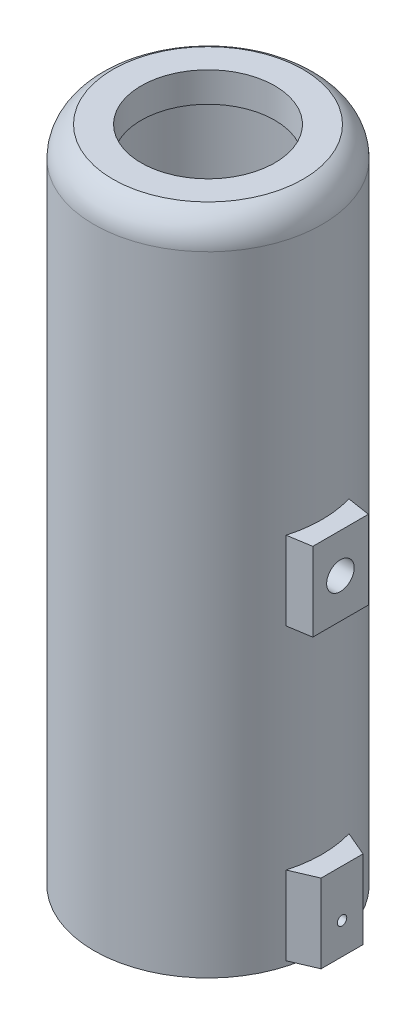
ISO-10303-21;
HEADER;
FILE_DESCRIPTION(('STEP AP214'),'2;1');
FILE_NAME('part.step','',(''),(''),'','','');
FILE_SCHEMA(('AUTOMOTIVE_DESIGN { 1 0 10303 214 1 1 1 1 }'));
ENDSEC;
DATA;
#1=APPLICATION_CONTEXT('core data for automotive mechanical design processes');
#2=APPLICATION_PROTOCOL_DEFINITION('international standard','automotive_design',2000,#1);
#3=PRODUCT_CONTEXT('',#1,'mechanical');
#4=PRODUCT('Part','Part','',(#3));
#5=PRODUCT_RELATED_PRODUCT_CATEGORY('part','',(#4));
#6=PRODUCT_DEFINITION_FORMATION('','',#4);
#7=PRODUCT_DEFINITION_CONTEXT('part definition',#1,'design');
#8=PRODUCT_DEFINITION('design','',#6,#7);
#9=PRODUCT_DEFINITION_SHAPE('','',#8);
#10=(LENGTH_UNIT() NAMED_UNIT(*) SI_UNIT(.MILLI.,.METRE.));
#11=(NAMED_UNIT(*) PLANE_ANGLE_UNIT() SI_UNIT($,.RADIAN.));
#12=(NAMED_UNIT(*) SI_UNIT($,.STERADIAN.) SOLID_ANGLE_UNIT());
#13=UNCERTAINTY_MEASURE_WITH_UNIT(LENGTH_MEASURE(1.E-05),#10,'distance_accuracy_value','');
#14=(GEOMETRIC_REPRESENTATION_CONTEXT(3) GLOBAL_UNCERTAINTY_ASSIGNED_CONTEXT((#13)) GLOBAL_UNIT_ASSIGNED_CONTEXT((#10,
#11,#12)) REPRESENTATION_CONTEXT('',''));
#15=CARTESIAN_POINT('',(0.,0.,0.));
#16=DIRECTION('',(0.,0.,1.));
#17=DIRECTION('',(1.,0.,0.));
#18=AXIS2_PLACEMENT_3D('',#15,#16,#17);
#19=CARTESIAN_POINT('',(0.,0.,0.));
#20=DIRECTION('',(0.,-1.,0.));
#21=DIRECTION('',(0.,0.,-1.));
#22=AXIS2_PLACEMENT_3D('',#19,#20,#21);
#23=CYLINDRICAL_SURFACE('',#22,14.5);
#24=CARTESIAN_POINT('',(0.,10.617688180379,0.));
#25=DIRECTION('',(0.,-1.,0.));
#26=DIRECTION('',(0.,0.,-1.));
#27=AXIS2_PLACEMENT_3D('',#24,#25,#26);
#28=CIRCLE('',#27,14.5);
#29=CARTESIAN_POINT('',(13.9382685998278,10.617688180379,-3.996832300592));
#30=VERTEX_POINT('',#29);
#31=CARTESIAN_POINT('',(13.9364503504449,10.617688180379,4.00316769940799));
#32=VERTEX_POINT('',#31);
#33=EDGE_CURVE('E217',#30,#32,#28,.T.);
#34=ORIENTED_EDGE('',*,*,#33,.F.);
#35=DIRECTION('',(0.,-1.,0.));
#36=VECTOR('',#35,1.);
#37=CARTESIAN_POINT('',(13.9382685998278,0.,-3.996832300592));
#38=LINE('',#37,#36);
#39=CARTESIAN_POINT('',(13.9382685998278,0.617688180378981,-3.996832300592));
#40=VERTEX_POINT('',#39);
#41=EDGE_CURVE('E231',#30,#40,#38,.T.);
#42=ORIENTED_EDGE('',*,*,#41,.T.);
#43=CARTESIAN_POINT('',(0.,0.617688180378981,0.));
#44=DIRECTION('',(0.,1.,0.));
#45=DIRECTION('',(0.,0.,1.));
#46=AXIS2_PLACEMENT_3D('',#43,#44,#45);
#47=CIRCLE('',#46,14.5);
#48=CARTESIAN_POINT('',(13.9364503504449,0.617688180379016,4.00316769940799));
#49=VERTEX_POINT('',#48);
#50=EDGE_CURVE('E235',#49,#40,#47,.T.);
#51=ORIENTED_EDGE('',*,*,#50,.F.);
#52=DIRECTION('',(0.,-1.,0.));
#53=VECTOR('',#52,1.);
#54=CARTESIAN_POINT('',(13.9364503504449,0.,4.00316769940799));
#55=LINE('',#54,#53);
#56=EDGE_CURVE('E144',#32,#49,#55,.T.);
#57=ORIENTED_EDGE('',*,*,#56,.F.);
#58=EDGE_LOOP('',(#34,#42,#51,#57));
#59=FACE_BOUND('',#58,.T.);
#60=CARTESIAN_POINT('',(0.,47.5,0.));
#61=DIRECTION('',(0.,-1.,0.));
#62=DIRECTION('',(0.,0.,-1.));
#63=AXIS2_PLACEMENT_3D('',#60,#61,#62);
#64=CIRCLE('',#63,14.5);
#65=CARTESIAN_POINT('',(13.9373598647664,47.5,-3.99999999999998));
#66=VERTEX_POINT('',#65);
#67=CARTESIAN_POINT('',(13.9373598647664,47.5,3.99999999999998));
#68=VERTEX_POINT('',#67);
#69=EDGE_CURVE('E234',#66,#68,#64,.T.);
#70=ORIENTED_EDGE('',*,*,#69,.F.);
#71=DIRECTION('',(0.,-1.,0.));
#72=VECTOR('',#71,1.);
#73=CARTESIAN_POINT('',(13.9373598647664,0.,-3.99999999999999));
#74=LINE('',#73,#72);
#75=CARTESIAN_POINT('',(13.9373598647664,37.5,-3.99999999999999));
#76=VERTEX_POINT('',#75);
#77=EDGE_CURVE('E240',#66,#76,#74,.T.);
#78=ORIENTED_EDGE('',*,*,#77,.T.);
#79=CARTESIAN_POINT('',(0.,37.5,0.));
#80=DIRECTION('',(0.,1.,0.));
#81=DIRECTION('',(0.,0.,1.));
#82=AXIS2_PLACEMENT_3D('',#79,#80,#81);
#83=CIRCLE('',#82,14.5);
#84=CARTESIAN_POINT('',(13.9373598647664,37.5,3.99999999999998));
#85=VERTEX_POINT('',#84);
#86=EDGE_CURVE('E244',#85,#76,#83,.T.);
#87=ORIENTED_EDGE('',*,*,#86,.F.);
#88=DIRECTION('',(0.,-1.,0.));
#89=VECTOR('',#88,1.);
#90=CARTESIAN_POINT('',(13.9373598647664,0.,3.99999999999998));
#91=LINE('',#90,#89);
#92=EDGE_CURVE('E247',#68,#85,#91,.T.);
#93=ORIENTED_EDGE('',*,*,#92,.F.);
#94=EDGE_LOOP('',(#70,#78,#87,#93));
#95=FACE_BOUND('',#94,.T.);
#96=CARTESIAN_POINT('',(0.,80.,0.));
#97=DIRECTION('',(0.,-1.,0.));
#98=DIRECTION('',(0.,0.,-1.));
#99=AXIS2_PLACEMENT_3D('',#96,#97,#98);
#100=CIRCLE('',#99,14.5);
#101=CARTESIAN_POINT('',(0.,80.,-14.5));
#102=VERTEX_POINT('',#101);
#103=EDGE_CURVE('E262',#102,#102,#100,.T.);
#104=ORIENTED_EDGE('',*,*,#103,.T.);
#105=EDGE_LOOP('',(#104));
#106=FACE_BOUND('',#105,.T.);
#107=CARTESIAN_POINT('',(0.,0.,0.));
#108=DIRECTION('',(0.,-1.,0.));
#109=DIRECTION('',(0.,0.,-1.));
#110=AXIS2_PLACEMENT_3D('',#107,#108,#109);
#111=CIRCLE('',#110,14.5);
#112=CARTESIAN_POINT('',(0.,0.,-14.5));
#113=VERTEX_POINT('',#112);
#114=EDGE_CURVE('E55',#113,#113,#111,.T.);
#115=ORIENTED_EDGE('',*,*,#114,.F.);
#116=EDGE_LOOP('',(#115));
#117=FACE_BOUND('',#116,.T.);
#118=CARTESIAN_POINT('',(0.,37.5,0.));
#119=DIRECTION('',(0.,-1.,0.));
#120=DIRECTION('',(0.,0.,1.));
#121=AXIS2_PLACEMENT_3D('',#118,#119,#120);
#122=CIRCLE('',#121,14.5);
#123=CARTESIAN_POINT('',(-13.9373598647664,37.5,3.99999999999998));
#124=VERTEX_POINT('',#123);
#125=CARTESIAN_POINT('',(-13.9373598647664,37.5,-3.99999999999999));
#126=VERTEX_POINT('',#125);
#127=EDGE_CURVE('E62',#124,#126,#122,.T.);
#128=ORIENTED_EDGE('',*,*,#127,.T.);
#129=DIRECTION('',(0.,-1.,0.));
#130=VECTOR('',#129,1.);
#131=CARTESIAN_POINT('',(-13.9373598647664,0.,-3.99999999999999));
#132=LINE('',#131,#130);
#133=CARTESIAN_POINT('',(-13.9373598647664,47.5,-3.99999999999998));
#134=VERTEX_POINT('',#133);
#135=EDGE_CURVE('E200',#134,#126,#132,.T.);
#136=ORIENTED_EDGE('',*,*,#135,.F.);
#137=CARTESIAN_POINT('',(0.,47.5,0.));
#138=DIRECTION('',(0.,1.,0.));
#139=DIRECTION('',(0.,0.,-1.));
#140=AXIS2_PLACEMENT_3D('',#137,#138,#139);
#141=CIRCLE('',#140,14.5);
#142=CARTESIAN_POINT('',(-13.9373598647664,47.5,3.99999999999998));
#143=VERTEX_POINT('',#142);
#144=EDGE_CURVE('E206',#134,#143,#141,.T.);
#145=ORIENTED_EDGE('',*,*,#144,.T.);
#146=DIRECTION('',(0.,-1.,0.));
#147=VECTOR('',#146,1.);
#148=CARTESIAN_POINT('',(-13.9373598647664,0.,3.99999999999998));
#149=LINE('',#148,#147);
#150=EDGE_CURVE('E178',#143,#124,#149,.T.);
#151=ORIENTED_EDGE('',*,*,#150,.T.);
#152=EDGE_LOOP('',(#128,#136,#145,#151));
#153=FACE_BOUND('',#152,.T.);
#154=ADVANCED_FACE('F47',(#59,#95,#106,#117,#153),#23,.T.);
#155=CARTESIAN_POINT('',(0.,0.,0.));
#156=DIRECTION('',(0.,-1.,0.));
#157=DIRECTION('',(0.,0.,-1.));
#158=AXIS2_PLACEMENT_3D('',#155,#156,#157);
#159=CYLINDRICAL_SURFACE('',#158,12.);
#160=CARTESIAN_POINT('',(0.,0.,0.));
#161=DIRECTION('',(0.,-1.,0.));
#162=DIRECTION('',(0.,0.,-1.));
#163=AXIS2_PLACEMENT_3D('',#160,#161,#162);
#164=CIRCLE('',#163,12.);
#165=CARTESIAN_POINT('',(0.,0.,-12.));
#166=VERTEX_POINT('',#165);
#167=EDGE_CURVE('E13',#166,#166,#164,.T.);
#168=ORIENTED_EDGE('',*,*,#167,.T.);
#169=EDGE_LOOP('',(#168));
#170=FACE_BOUND('',#169,.T.);
#171=CARTESIAN_POINT('',(0.,80.,0.));
#172=DIRECTION('',(0.,-1.,0.));
#173=DIRECTION('',(0.,0.,-1.));
#174=AXIS2_PLACEMENT_3D('',#171,#172,#173);
#175=CIRCLE('',#174,12.);
#176=CARTESIAN_POINT('',(0.,80.,-12.));
#177=VERTEX_POINT('',#176);
#178=EDGE_CURVE('E243',#177,#177,#175,.T.);
#179=ORIENTED_EDGE('',*,*,#178,.F.);
#180=EDGE_LOOP('',(#179));
#181=FACE_BOUND('',#180,.T.);
#182=ADVANCED_FACE('F49',(#170,#181),#159,.F.);
#183=CARTESIAN_POINT('',(12.,0.,0.));
#184=DIRECTION('',(0.,-1.,0.));
#185=DIRECTION('',(0.,0.,-1.));
#186=AXIS2_PLACEMENT_3D('',#183,#184,#185);
#187=PLANE('',#186);
#188=ORIENTED_EDGE('',*,*,#114,.T.);
#189=EDGE_LOOP('',(#188));
#190=FACE_BOUND('',#189,.T.);
#191=ORIENTED_EDGE('',*,*,#167,.F.);
#192=EDGE_LOOP('',(#191));
#193=FACE_BOUND('',#192,.T.);
#194=ADVANCED_FACE('F267',(#190,#193),#187,.T.);
#195=CARTESIAN_POINT('',(0.,80.,0.));
#196=DIRECTION('',(0.,-1.,0.));
#197=DIRECTION('',(0.,0.,-1.));
#198=AXIS2_PLACEMENT_3D('',#195,#196,#197);
#199=TOROIDAL_SURFACE('',#198,10.3002002332007,4.19979976679926);
#200=CARTESIAN_POINT('',(0.,83.7944165825053,0.));
#201=DIRECTION('',(0.,-1.,0.));
#202=DIRECTION('',(0.,0.,-1.));
#203=AXIS2_PLACEMENT_3D('',#200,#201,#202);
#204=CIRCLE('',#203,12.1004004664015);
#205=CARTESIAN_POINT('',(0.,83.7944165825053,-12.1004004664015));
#206=VERTEX_POINT('',#205);
#207=EDGE_CURVE('E259',#206,#206,#204,.T.);
#208=ORIENTED_EDGE('',*,*,#207,.T.);
#209=EDGE_LOOP('',(#208));
#210=FACE_BOUND('',#209,.T.);
#211=ORIENTED_EDGE('',*,*,#103,.F.);
#212=EDGE_LOOP('',(#211));
#213=FACE_BOUND('',#212,.T.);
#214=ADVANCED_FACE('F344',(#210,#213),#199,.T.);
#215=CARTESIAN_POINT('',(8.5,83.7944165825053,0.));
#216=DIRECTION('',(0.,1.,0.));
#217=DIRECTION('',(0.,0.,1.));
#218=AXIS2_PLACEMENT_3D('',#215,#216,#217);
#219=PLANE('',#218);
#220=CARTESIAN_POINT('',(0.,83.7944165825053,0.));
#221=DIRECTION('',(0.,-1.,0.));
#222=DIRECTION('',(0.,0.,-1.));
#223=AXIS2_PLACEMENT_3D('',#220,#221,#222);
#224=CIRCLE('',#223,8.5);
#225=CARTESIAN_POINT('',(0.,83.7944165825053,-8.5));
#226=VERTEX_POINT('',#225);
#227=EDGE_CURVE('E256',#226,#226,#224,.T.);
#228=ORIENTED_EDGE('',*,*,#227,.T.);
#229=EDGE_LOOP('',(#228));
#230=FACE_BOUND('',#229,.T.);
#231=ORIENTED_EDGE('',*,*,#207,.F.);
#232=EDGE_LOOP('',(#231));
#233=FACE_BOUND('',#232,.T.);
#234=ADVANCED_FACE('F340',(#230,#233),#219,.T.);
#235=CARTESIAN_POINT('',(0.,0.,0.));
#236=DIRECTION('',(0.,-1.,0.));
#237=DIRECTION('',(0.,0.,-1.));
#238=AXIS2_PLACEMENT_3D('',#235,#236,#237);
#239=CYLINDRICAL_SURFACE('',#238,8.5);
#240=CARTESIAN_POINT('',(0.,80.,0.));
#241=DIRECTION('',(0.,-1.,0.));
#242=DIRECTION('',(0.,0.,-1.));
#243=AXIS2_PLACEMENT_3D('',#240,#241,#242);
#244=CIRCLE('',#243,8.5);
#245=CARTESIAN_POINT('',(0.,80.,-8.5));
#246=VERTEX_POINT('',#245);
#247=EDGE_CURVE('E253',#246,#246,#244,.T.);
#248=ORIENTED_EDGE('',*,*,#247,.T.);
#249=EDGE_LOOP('',(#248));
#250=FACE_BOUND('',#249,.T.);
#251=ORIENTED_EDGE('',*,*,#227,.F.);
#252=EDGE_LOOP('',(#251));
#253=FACE_BOUND('',#252,.T.);
#254=ADVANCED_FACE('F336',(#250,#253),#239,.F.);
#255=CARTESIAN_POINT('',(12.,80.,0.));
#256=DIRECTION('',(0.,-1.,0.));
#257=DIRECTION('',(0.,0.,-1.));
#258=AXIS2_PLACEMENT_3D('',#255,#256,#257);
#259=PLANE('',#258);
#260=ORIENTED_EDGE('',*,*,#178,.T.);
#261=EDGE_LOOP('',(#260));
#262=FACE_BOUND('',#261,.T.);
#263=ORIENTED_EDGE('',*,*,#247,.F.);
#264=EDGE_LOOP('',(#263));
#265=FACE_BOUND('',#264,.T.);
#266=ADVANCED_FACE('F329',(#262,#265),#259,.T.);
#267=CARTESIAN_POINT('',(13.9373598647664,47.5,3.99999999999998));
#268=DIRECTION('',(0.,1.,0.));
#269=DIRECTION('',(0.,0.,1.));
#270=AXIS2_PLACEMENT_3D('',#267,#268,#269);
#271=PLANE('',#270);
#272=DIRECTION('',(-0.987420935954633,0.,-0.158113551723046));
#273=VECTOR('',#272,1.);
#274=CARTESIAN_POINT('',(16.8633842019587,47.5,-3.53146213176624));
#275=LINE('',#274,#273);
#276=CARTESIAN_POINT('',(16.8633842019587,47.5,-3.53146213176624));
#277=VERTEX_POINT('',#276);
#278=EDGE_CURVE('E214',#277,#66,#275,.T.);
#279=ORIENTED_EDGE('',*,*,#278,.T.);
#280=ORIENTED_EDGE('',*,*,#69,.T.);
#281=DIRECTION('',(0.987420935954634,0.,-0.158113551723044));
#282=VECTOR('',#281,1.);
#283=CARTESIAN_POINT('',(13.9373598647664,47.5,3.99999999999998));
#284=LINE('',#283,#282);
#285=CARTESIAN_POINT('',(16.8633842019587,47.5,3.53146213176624));
#286=VERTEX_POINT('',#285);
#287=EDGE_CURVE('E213',#68,#286,#284,.T.);
#288=ORIENTED_EDGE('',*,*,#287,.T.);
#289=DIRECTION('',(0.,0.,-1.));
#290=VECTOR('',#289,1.);
#291=CARTESIAN_POINT('',(16.8633842019587,47.5,3.53146213176624));
#292=LINE('',#291,#290);
#293=EDGE_CURVE('E210',#286,#277,#292,.T.);
#294=ORIENTED_EDGE('',*,*,#293,.T.);
#295=EDGE_LOOP('',(#279,#280,#288,#294));
#296=FACE_BOUND('',#295,.T.);
#297=ADVANCED_FACE('F326',(#296),#271,.T.);
#298=CARTESIAN_POINT('',(13.9373598647664,37.5,-3.99999999999999));
#299=DIRECTION('',(0.,-1.,0.));
#300=DIRECTION('',(0.,0.,-1.));
#301=AXIS2_PLACEMENT_3D('',#298,#299,#300);
#302=PLANE('',#301);
#303=DIRECTION('',(-0.987420935954633,0.,-0.158113551723046));
#304=VECTOR('',#303,1.);
#305=CARTESIAN_POINT('',(16.8633842019587,37.5,-3.53146213176624));
#306=LINE('',#305,#304);
#307=CARTESIAN_POINT('',(16.8633842019587,37.5,-3.53146213176624));
#308=VERTEX_POINT('',#307);
#309=EDGE_CURVE('E221',#308,#76,#306,.T.);
#310=ORIENTED_EDGE('',*,*,#309,.F.);
#311=DIRECTION('',(0.,0.,-1.));
#312=VECTOR('',#311,1.);
#313=CARTESIAN_POINT('',(16.8633842019587,37.5,3.53146213176624));
#314=LINE('',#313,#312);
#315=CARTESIAN_POINT('',(16.8633842019587,37.5,3.53146213176625));
#316=VERTEX_POINT('',#315);
#317=EDGE_CURVE('E219',#316,#308,#314,.T.);
#318=ORIENTED_EDGE('',*,*,#317,.F.);
#319=DIRECTION('',(0.987420935954634,0.,-0.158113551723044));
#320=VECTOR('',#319,1.);
#321=CARTESIAN_POINT('',(13.9373598647664,37.5,3.99999999999998));
#322=LINE('',#321,#320);
#323=EDGE_CURVE('E209',#85,#316,#322,.T.);
#324=ORIENTED_EDGE('',*,*,#323,.F.);
#325=ORIENTED_EDGE('',*,*,#86,.T.);
#326=EDGE_LOOP('',(#310,#318,#324,#325));
#327=FACE_BOUND('',#326,.T.);
#328=ADVANCED_FACE('F322',(#327),#302,.T.);
#329=CARTESIAN_POINT('',(13.9364503504449,10.617688180379,4.00316769940799));
#330=DIRECTION('',(0.,1.,0.));
#331=DIRECTION('',(0.,0.,1.));
#332=AXIS2_PLACEMENT_3D('',#329,#330,#331);
#333=PLANE('',#332);
#334=DIRECTION('',(-0.919710823156126,0.,-0.39259648720981));
#335=VECTOR('',#334,1.);
#336=CARTESIAN_POINT('',(17.0525339543547,10.617688180379,-2.66744744652363));
#337=LINE('',#336,#335);
#338=CARTESIAN_POINT('',(17.0525339543547,10.617688180379,-2.66744744652363));
#339=VERTEX_POINT('',#338);
#340=EDGE_CURVE('E164',#339,#30,#337,.T.);
#341=ORIENTED_EDGE('',*,*,#340,.T.);
#342=ORIENTED_EDGE('',*,*,#33,.T.);
#343=DIRECTION('',(0.919117704025341,0.,-0.393983053121813));
#344=VECTOR('',#343,1.);
#345=CARTESIAN_POINT('',(13.9364503504449,10.617688180379,4.00316769940799));
#346=LINE('',#345,#344);
#347=CARTESIAN_POINT('',(17.0525339543547,10.617688180379,2.66744744652364));
#348=VERTEX_POINT('',#347);
#349=EDGE_CURVE('E174',#32,#348,#346,.T.);
#350=ORIENTED_EDGE('',*,*,#349,.T.);
#351=DIRECTION('',(0.,0.,-1.));
#352=VECTOR('',#351,1.);
#353=CARTESIAN_POINT('',(17.0525339543547,10.617688180379,2.66744744652364));
#354=LINE('',#353,#352);
#355=EDGE_CURVE('E155',#348,#339,#354,.T.);
#356=ORIENTED_EDGE('',*,*,#355,.T.);
#357=EDGE_LOOP('',(#341,#342,#350,#356));
#358=FACE_BOUND('',#357,.T.);
#359=ADVANCED_FACE('F313',(#358),#333,.T.);
#360=CARTESIAN_POINT('',(13.9382685998278,0.617688180378981,-3.996832300592));
#361=DIRECTION('',(0.,-1.,0.));
#362=DIRECTION('',(0.,0.,-1.));
#363=AXIS2_PLACEMENT_3D('',#360,#361,#362);
#364=PLANE('',#363);
#365=DIRECTION('',(-0.919710823156126,0.,-0.39259648720981));
#366=VECTOR('',#365,1.);
#367=CARTESIAN_POINT('',(17.0525339543547,0.617688180378995,-2.66744744652363));
#368=LINE('',#367,#366);
#369=CARTESIAN_POINT('',(17.0525339543547,0.617688180378999,-2.66744744652363));
#370=VERTEX_POINT('',#369);
#371=EDGE_CURVE('E70',#370,#40,#368,.T.);
#372=ORIENTED_EDGE('',*,*,#371,.F.);
#373=DIRECTION('',(0.,0.,-1.));
#374=VECTOR('',#373,1.);
#375=CARTESIAN_POINT('',(17.0525339543547,0.617688180378995,2.66744744652364));
#376=LINE('',#375,#374);
#377=CARTESIAN_POINT('',(17.0525339543547,0.617688180378999,2.66744744652365));
#378=VERTEX_POINT('',#377);
#379=EDGE_CURVE('E148',#378,#370,#376,.T.);
#380=ORIENTED_EDGE('',*,*,#379,.F.);
#381=DIRECTION('',(0.919117704025341,0.,-0.393983053121813));
#382=VECTOR('',#381,1.);
#383=CARTESIAN_POINT('',(13.9364503504449,0.617688180378995,4.00316769940799));
#384=LINE('',#383,#382);
#385=EDGE_CURVE('E138',#49,#378,#384,.T.);
#386=ORIENTED_EDGE('',*,*,#385,.F.);
#387=ORIENTED_EDGE('',*,*,#50,.T.);
#388=EDGE_LOOP('',(#372,#380,#386,#387));
#389=FACE_BOUND('',#388,.T.);
#390=ADVANCED_FACE('F158',(#389),#364,.T.);
#391=CARTESIAN_POINT('',(16.8633842019587,224.625691680575,-3.53146213176624));
#392=DIRECTION('',(-0.158113551723046,0.,0.987420935954633));
#393=DIRECTION('',(0.987420935954633,0.,0.158113551723046));
#394=AXIS2_PLACEMENT_3D('',#391,#392,#393);
#395=PLANE('',#394);
#396=DIRECTION('',(0.,-1.,0.));
#397=VECTOR('',#396,1.);
#398=CARTESIAN_POINT('',(16.8633842019587,224.625691680575,-3.53146213176624));
#399=LINE('',#398,#397);
#400=EDGE_CURVE('E226',#277,#308,#399,.T.);
#401=ORIENTED_EDGE('',*,*,#400,.T.);
#402=ORIENTED_EDGE('',*,*,#309,.T.);
#403=ORIENTED_EDGE('',*,*,#77,.F.);
#404=ORIENTED_EDGE('',*,*,#278,.F.);
#405=EDGE_LOOP('',(#401,#402,#403,#404));
#406=FACE_BOUND('',#405,.T.);
#407=ADVANCED_FACE('F308',(#406),#395,.F.);
#408=CARTESIAN_POINT('',(16.8633842019587,224.625691680575,3.53146213176624));
#409=DIRECTION('',(-1.,0.,0.));
#410=DIRECTION('',(0.,0.,1.));
#411=AXIS2_PLACEMENT_3D('',#408,#409,#410);
#412=PLANE('',#411);
#413=CARTESIAN_POINT('',(16.8633842019587,42.5128676573704,0.0212645796614426));
#414=DIRECTION('',(1.,0.,0.));
#415=DIRECTION('',(0.,0.,-1.));
#416=AXIS2_PLACEMENT_3D('',#413,#414,#415);
#417=CIRCLE('',#416,1.74999999999976);
#418=CARTESIAN_POINT('',(16.8633842019587,42.5128676573704,-1.72873542033832));
#419=VERTEX_POINT('',#418);
#420=EDGE_CURVE('E171',#419,#419,#417,.T.);
#421=ORIENTED_EDGE('',*,*,#420,.F.);
#422=EDGE_LOOP('',(#421));
#423=FACE_BOUND('',#422,.T.);
#424=DIRECTION('',(0.,-1.,0.));
#425=VECTOR('',#424,1.);
#426=CARTESIAN_POINT('',(16.8633842019587,224.625691680575,3.53146213176624));
#427=LINE('',#426,#425);
#428=EDGE_CURVE('E223',#286,#316,#427,.T.);
#429=ORIENTED_EDGE('',*,*,#428,.T.);
#430=ORIENTED_EDGE('',*,*,#317,.T.);
#431=ORIENTED_EDGE('',*,*,#400,.F.);
#432=ORIENTED_EDGE('',*,*,#293,.F.);
#433=EDGE_LOOP('',(#429,#430,#431,#432));
#434=FACE_BOUND('',#433,.T.);
#435=ADVANCED_FACE('F311',(#423,#434),#412,.F.);
#436=CARTESIAN_POINT('',(13.9373598647664,224.625691680575,3.99999999999998));
#437=DIRECTION('',(-0.158113551723044,0.,-0.987420935954634));
#438=DIRECTION('',(-0.987420935954634,0.,0.158113551723044));
#439=AXIS2_PLACEMENT_3D('',#436,#437,#438);
#440=PLANE('',#439);
#441=ORIENTED_EDGE('',*,*,#92,.T.);
#442=ORIENTED_EDGE('',*,*,#323,.T.);
#443=ORIENTED_EDGE('',*,*,#428,.F.);
#444=ORIENTED_EDGE('',*,*,#287,.F.);
#445=EDGE_LOOP('',(#441,#442,#443,#444));
#446=FACE_BOUND('',#445,.T.);
#447=ADVANCED_FACE('F307',(#446),#440,.F.);
#448=CARTESIAN_POINT('',(-13.9373598647664,47.5,3.99999999999998));
#449=DIRECTION('',(0.,1.,0.));
#450=DIRECTION('',(0.,0.,1.));
#451=AXIS2_PLACEMENT_3D('',#448,#449,#450);
#452=PLANE('',#451);
#453=DIRECTION('',(0.987420935954633,0.,-0.158113551723046));
#454=VECTOR('',#453,1.);
#455=CARTESIAN_POINT('',(-16.8633842019587,47.5,-3.53146213176624));
#456=LINE('',#455,#454);
#457=CARTESIAN_POINT('',(-16.8633842019587,47.5,-3.53146213176624));
#458=VERTEX_POINT('',#457);
#459=EDGE_CURVE('E203',#458,#134,#456,.T.);
#460=ORIENTED_EDGE('',*,*,#459,.F.);
#461=DIRECTION('',(0.,0.,-1.));
#462=VECTOR('',#461,1.);
#463=CARTESIAN_POINT('',(-16.8633842019587,47.5,3.53146213176624));
#464=LINE('',#463,#462);
#465=CARTESIAN_POINT('',(-16.8633842019587,47.5,3.53146213176624));
#466=VERTEX_POINT('',#465);
#467=EDGE_CURVE('E195',#466,#458,#464,.T.);
#468=ORIENTED_EDGE('',*,*,#467,.F.);
#469=DIRECTION('',(-0.987420935954634,0.,-0.158113551723044));
#470=VECTOR('',#469,1.);
#471=CARTESIAN_POINT('',(-13.9373598647664,47.5,3.99999999999998));
#472=LINE('',#471,#470);
#473=EDGE_CURVE('E187',#143,#466,#472,.T.);
#474=ORIENTED_EDGE('',*,*,#473,.F.);
#475=ORIENTED_EDGE('',*,*,#144,.F.);
#476=EDGE_LOOP('',(#460,#468,#474,#475));
#477=FACE_BOUND('',#476,.T.);
#478=ADVANCED_FACE('F288',(#477),#452,.T.);
#479=CARTESIAN_POINT('',(-13.9373598647664,37.5,-3.99999999999999));
#480=DIRECTION('',(0.,-1.,0.));
#481=DIRECTION('',(0.,0.,-1.));
#482=AXIS2_PLACEMENT_3D('',#479,#480,#481);
#483=PLANE('',#482);
#484=DIRECTION('',(0.987420935954633,0.,-0.158113551723046));
#485=VECTOR('',#484,1.);
#486=CARTESIAN_POINT('',(-16.8633842019587,37.5,-3.53146213176624));
#487=LINE('',#486,#485);
#488=CARTESIAN_POINT('',(-16.8633842019587,37.5,-3.53146213176624));
#489=VERTEX_POINT('',#488);
#490=EDGE_CURVE('E198',#489,#126,#487,.T.);
#491=ORIENTED_EDGE('',*,*,#490,.T.);
#492=ORIENTED_EDGE('',*,*,#127,.F.);
#493=DIRECTION('',(-0.987420935954634,0.,-0.158113551723044));
#494=VECTOR('',#493,1.);
#495=CARTESIAN_POINT('',(-13.9373598647664,37.5,3.99999999999998));
#496=LINE('',#495,#494);
#497=CARTESIAN_POINT('',(-16.8633842019587,37.5,3.53146213176625));
#498=VERTEX_POINT('',#497);
#499=EDGE_CURVE('E183',#124,#498,#496,.T.);
#500=ORIENTED_EDGE('',*,*,#499,.T.);
#501=DIRECTION('',(0.,0.,-1.));
#502=VECTOR('',#501,1.);
#503=CARTESIAN_POINT('',(-16.8633842019587,37.5,3.53146213176624));
#504=LINE('',#503,#502);
#505=EDGE_CURVE('E190',#498,#489,#504,.T.);
#506=ORIENTED_EDGE('',*,*,#505,.T.);
#507=EDGE_LOOP('',(#491,#492,#500,#506));
#508=FACE_BOUND('',#507,.T.);
#509=ADVANCED_FACE('F281',(#508),#483,.T.);
#510=CARTESIAN_POINT('',(-16.8633842019587,224.625691680575,-3.53146213176624));
#511=DIRECTION('',(0.158113551723046,0.,0.987420935954633));
#512=DIRECTION('',(-0.987420935954633,0.,0.158113551723046));
#513=AXIS2_PLACEMENT_3D('',#510,#511,#512);
#514=PLANE('',#513);
#515=DIRECTION('',(0.,-1.,0.));
#516=VECTOR('',#515,1.);
#517=CARTESIAN_POINT('',(-16.8633842019587,224.625691680575,-3.53146213176624));
#518=LINE('',#517,#516);
#519=EDGE_CURVE('E193',#458,#489,#518,.T.);
#520=ORIENTED_EDGE('',*,*,#519,.F.);
#521=ORIENTED_EDGE('',*,*,#459,.T.);
#522=ORIENTED_EDGE('',*,*,#135,.T.);
#523=ORIENTED_EDGE('',*,*,#490,.F.);
#524=EDGE_LOOP('',(#520,#521,#522,#523));
#525=FACE_BOUND('',#524,.T.);
#526=ADVANCED_FACE('F285',(#525),#514,.F.);
#527=CARTESIAN_POINT('',(-16.8633842019587,224.625691680575,3.53146213176624));
#528=DIRECTION('',(1.,0.,0.));
#529=DIRECTION('',(0.,0.,1.));
#530=AXIS2_PLACEMENT_3D('',#527,#528,#529);
#531=PLANE('',#530);
#532=CARTESIAN_POINT('',(-16.8633842019587,42.5128676573704,0.0212645796614426));
#533=DIRECTION('',(-1.,0.,0.));
#534=DIRECTION('',(0.,0.,1.));
#535=AXIS2_PLACEMENT_3D('',#532,#533,#534);
#536=CIRCLE('',#535,1.74999999999965);
#537=CARTESIAN_POINT('',(-16.8633842019587,42.5128676573704,1.77126457966109));
#538=VERTEX_POINT('',#537);
#539=EDGE_CURVE('E170',#538,#538,#536,.T.);
#540=ORIENTED_EDGE('',*,*,#539,.F.);
#541=EDGE_LOOP('',(#540));
#542=FACE_BOUND('',#541,.T.);
#543=DIRECTION('',(0.,-1.,0.));
#544=VECTOR('',#543,1.);
#545=CARTESIAN_POINT('',(-16.8633842019587,224.625691680575,3.53146213176624));
#546=LINE('',#545,#544);
#547=EDGE_CURVE('E185',#466,#498,#546,.T.);
#548=ORIENTED_EDGE('',*,*,#547,.F.);
#549=ORIENTED_EDGE('',*,*,#467,.T.);
#550=ORIENTED_EDGE('',*,*,#519,.T.);
#551=ORIENTED_EDGE('',*,*,#505,.F.);
#552=EDGE_LOOP('',(#548,#549,#550,#551));
#553=FACE_BOUND('',#552,.T.);
#554=ADVANCED_FACE('F289',(#542,#553),#531,.F.);
#555=CARTESIAN_POINT('',(-13.9373598647664,224.625691680575,3.99999999999998));
#556=DIRECTION('',(0.158113551723044,0.,-0.987420935954634));
#557=DIRECTION('',(0.987420935954634,0.,0.158113551723044));
#558=AXIS2_PLACEMENT_3D('',#555,#556,#557);
#559=PLANE('',#558);
#560=ORIENTED_EDGE('',*,*,#150,.F.);
#561=ORIENTED_EDGE('',*,*,#473,.T.);
#562=ORIENTED_EDGE('',*,*,#547,.T.);
#563=ORIENTED_EDGE('',*,*,#499,.F.);
#564=EDGE_LOOP('',(#560,#561,#562,#563));
#565=FACE_BOUND('',#564,.T.);
#566=ADVANCED_FACE('F278',(#565),#559,.F.);
#567=CARTESIAN_POINT('',(-13.8633842019587,42.5128676573704,0.0212645796614426));
#568=DIRECTION('',(-1.,0.,0.));
#569=DIRECTION('',(0.,0.,1.));
#570=AXIS2_PLACEMENT_3D('',#567,#568,#569);
#571=CYLINDRICAL_SURFACE('',#570,1.74999999999965);
#572=CARTESIAN_POINT('',(-13.8633842019587,42.5128676573704,0.0212645796614426));
#573=DIRECTION('',(-1.,0.,0.));
#574=DIRECTION('',(0.,0.,1.));
#575=AXIS2_PLACEMENT_3D('',#572,#573,#574);
#576=CIRCLE('',#575,1.74999999999965);
#577=CARTESIAN_POINT('',(-13.8633842019587,42.5128676573704,1.77126457966109));
#578=VERTEX_POINT('',#577);
#579=EDGE_CURVE('E175',#578,#578,#576,.T.);
#580=ORIENTED_EDGE('',*,*,#579,.F.);
#581=EDGE_LOOP('',(#580));
#582=FACE_BOUND('',#581,.T.);
#583=ORIENTED_EDGE('',*,*,#539,.T.);
#584=EDGE_LOOP('',(#583));
#585=FACE_BOUND('',#584,.T.);
#586=ADVANCED_FACE('F297',(#582,#585),#571,.F.);
#587=CARTESIAN_POINT('',(-13.8633842019587,42.5128676573704,0.0212645796614426));
#588=DIRECTION('',(-1.,0.,0.));
#589=DIRECTION('',(0.,0.,1.));
#590=AXIS2_PLACEMENT_3D('',#587,#588,#589);
#591=PLANE('',#590);
#592=ORIENTED_EDGE('',*,*,#579,.T.);
#593=EDGE_LOOP('',(#592));
#594=FACE_BOUND('',#593,.T.);
#595=ADVANCED_FACE('F449',(#594),#591,.T.);
#596=CARTESIAN_POINT('',(13.8633842019587,42.5128676573704,0.0212645796614426));
#597=DIRECTION('',(1.,0.,0.));
#598=DIRECTION('',(0.,0.,-1.));
#599=AXIS2_PLACEMENT_3D('',#596,#597,#598);
#600=CYLINDRICAL_SURFACE('',#599,1.74999999999976);
#601=CARTESIAN_POINT('',(13.8633842019587,42.5128676573704,0.0212645796614426));
#602=DIRECTION('',(1.,0.,0.));
#603=DIRECTION('',(0.,0.,-1.));
#604=AXIS2_PLACEMENT_3D('',#601,#602,#603);
#605=CIRCLE('',#604,1.74999999999976);
#606=CARTESIAN_POINT('',(13.8633842019587,42.5128676573704,-1.72873542033832));
#607=VERTEX_POINT('',#606);
#608=EDGE_CURVE('E167',#607,#607,#605,.T.);
#609=ORIENTED_EDGE('',*,*,#608,.F.);
#610=EDGE_LOOP('',(#609));
#611=FACE_BOUND('',#610,.T.);
#612=ORIENTED_EDGE('',*,*,#420,.T.);
#613=EDGE_LOOP('',(#612));
#614=FACE_BOUND('',#613,.T.);
#615=ADVANCED_FACE('F445',(#611,#614),#600,.F.);
#616=CARTESIAN_POINT('',(13.8633842019587,42.5128676573704,0.0212645796614426));
#617=DIRECTION('',(1.,0.,0.));
#618=DIRECTION('',(0.,0.,-1.));
#619=AXIS2_PLACEMENT_3D('',#616,#617,#618);
#620=PLANE('',#619);
#621=ORIENTED_EDGE('',*,*,#608,.T.);
#622=EDGE_LOOP('',(#621));
#623=FACE_BOUND('',#622,.T.);
#624=ADVANCED_FACE('F380',(#623),#620,.T.);
#625=CARTESIAN_POINT('',(17.0525339543547,216.12610738927,-2.66744744652363));
#626=DIRECTION('',(-0.39259648720981,0.,0.919710823156125));
#627=DIRECTION('',(0.919710823156126,0.,0.39259648720981));
#628=AXIS2_PLACEMENT_3D('',#625,#626,#627);
#629=PLANE('',#628);
#630=DIRECTION('',(0.,-1.,0.));
#631=VECTOR('',#630,1.);
#632=CARTESIAN_POINT('',(17.0525339543547,216.12610738927,-2.66744744652363));
#633=LINE('',#632,#631);
#634=EDGE_CURVE('E156',#339,#370,#633,.T.);
#635=ORIENTED_EDGE('',*,*,#634,.T.);
#636=ORIENTED_EDGE('',*,*,#371,.T.);
#637=ORIENTED_EDGE('',*,*,#41,.F.);
#638=ORIENTED_EDGE('',*,*,#340,.F.);
#639=EDGE_LOOP('',(#635,#636,#637,#638));
#640=FACE_BOUND('',#639,.T.);
#641=ADVANCED_FACE('F398',(#640),#629,.F.);
#642=CARTESIAN_POINT('',(17.0525339543547,216.12610738927,2.66744744652364));
#643=DIRECTION('',(-1.,0.,0.));
#644=DIRECTION('',(0.,0.,1.));
#645=AXIS2_PLACEMENT_3D('',#642,#643,#644);
#646=PLANE('',#645);
#647=CARTESIAN_POINT('',(17.0525339543547,4.617688180379,0.));
#648=DIRECTION('',(1.,0.,0.));
#649=DIRECTION('',(0.,0.,-1.));
#650=AXIS2_PLACEMENT_3D('',#647,#648,#649);
#651=CIRCLE('',#650,0.6);
#652=CARTESIAN_POINT('',(17.0525339543547,4.617688180379,-0.6));
#653=VERTEX_POINT('',#652);
#654=EDGE_CURVE('E579',#653,#653,#651,.T.);
#655=ORIENTED_EDGE('',*,*,#654,.F.);
#656=EDGE_LOOP('',(#655));
#657=FACE_BOUND('',#656,.T.);
#658=DIRECTION('',(0.,-1.,0.));
#659=VECTOR('',#658,1.);
#660=CARTESIAN_POINT('',(17.0525339543547,216.12610738927,2.66744744652364));
#661=LINE('',#660,#659);
#662=EDGE_CURVE('E141',#348,#378,#661,.T.);
#663=ORIENTED_EDGE('',*,*,#662,.T.);
#664=ORIENTED_EDGE('',*,*,#379,.T.);
#665=ORIENTED_EDGE('',*,*,#634,.F.);
#666=ORIENTED_EDGE('',*,*,#355,.F.);
#667=EDGE_LOOP('',(#663,#664,#665,#666));
#668=FACE_BOUND('',#667,.T.);
#669=ADVANCED_FACE('F152',(#657,#668),#646,.F.);
#670=CARTESIAN_POINT('',(13.9364503504449,216.12610738927,4.00316769940799));
#671=DIRECTION('',(-0.393983053121813,0.,-0.919117704025341));
#672=DIRECTION('',(-0.919117704025341,0.,0.393983053121813));
#673=AXIS2_PLACEMENT_3D('',#670,#671,#672);
#674=PLANE('',#673);
#675=ORIENTED_EDGE('',*,*,#56,.T.);
#676=ORIENTED_EDGE('',*,*,#385,.T.);
#677=ORIENTED_EDGE('',*,*,#662,.F.);
#678=ORIENTED_EDGE('',*,*,#349,.F.);
#679=EDGE_LOOP('',(#675,#676,#677,#678));
#680=FACE_BOUND('',#679,.T.);
#681=ADVANCED_FACE('F140',(#680),#674,.F.);
#682=CARTESIAN_POINT('',(14.0525339543547,4.617688180379,0.));
#683=DIRECTION('',(1.,0.,0.));
#684=DIRECTION('',(0.,0.,-1.));
#685=AXIS2_PLACEMENT_3D('',#682,#683,#684);
#686=CYLINDRICAL_SURFACE('',#685,0.6);
#687=CARTESIAN_POINT('',(14.0525339543547,4.617688180379,0.));
#688=DIRECTION('',(1.,0.,0.));
#689=DIRECTION('',(0.,0.,-1.));
#690=AXIS2_PLACEMENT_3D('',#687,#688,#689);
#691=CIRCLE('',#690,0.6);
#692=CARTESIAN_POINT('',(14.0525339543547,4.617688180379,-0.6));
#693=VERTEX_POINT('',#692);
#694=EDGE_CURVE('E149',#693,#693,#691,.T.);
#695=ORIENTED_EDGE('',*,*,#694,.F.);
#696=EDGE_LOOP('',(#695));
#697=FACE_BOUND('',#696,.T.);
#698=ORIENTED_EDGE('',*,*,#654,.T.);
#699=EDGE_LOOP('',(#698));
#700=FACE_BOUND('',#699,.T.);
#701=ADVANCED_FACE('F412',(#697,#700),#686,.F.);
#702=CARTESIAN_POINT('',(14.0525339543547,4.617688180379,0.));
#703=DIRECTION('',(1.,0.,0.));
#704=DIRECTION('',(0.,0.,-1.));
#705=AXIS2_PLACEMENT_3D('',#702,#703,#704);
#706=PLANE('',#705);
#707=ORIENTED_EDGE('',*,*,#694,.T.);
#708=EDGE_LOOP('',(#707));
#709=FACE_BOUND('',#708,.T.);
#710=ADVANCED_FACE('F428',(#709),#706,.T.);
#711=CLOSED_SHELL('',(#154,#182,#194,#214,#234,#254,#266,#297,#328,#359,#390,#407,#435,#447,
#478,#509,#526,#554,#566,#586,#595,#615,#624,#641,#669,#681,#701,#710));
#712=MANIFOLD_SOLID_BREP('B2',#711);
#713=ADVANCED_BREP_SHAPE_REPRESENTATION('',(#18,#712),#14);
#714=SHAPE_DEFINITION_REPRESENTATION(#9,#713);
ENDSEC;
END-ISO-10303-21;
